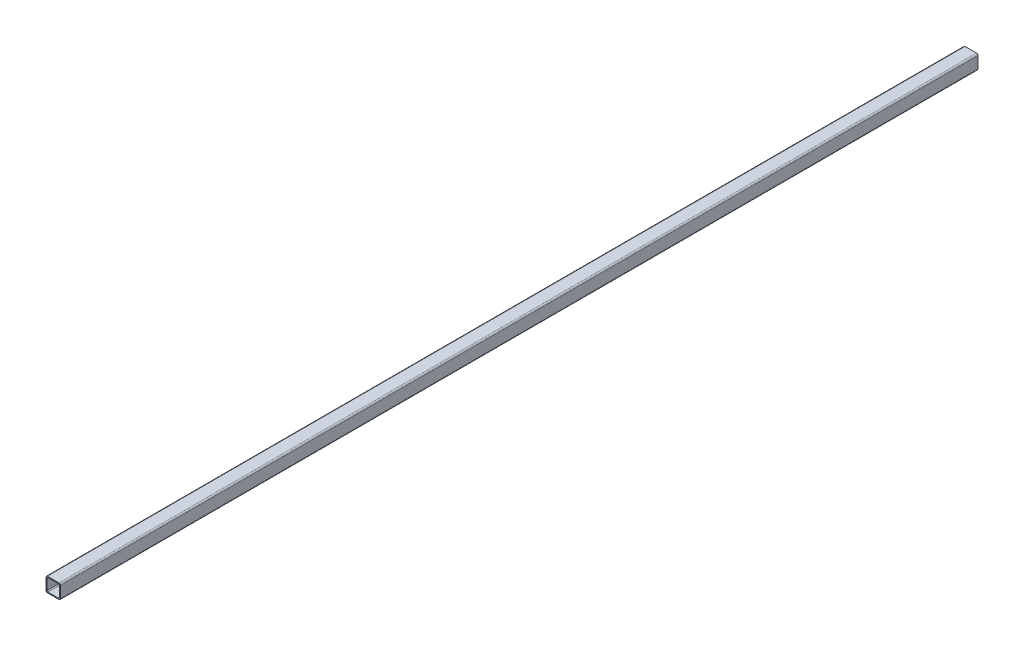
ISO-10303-21;
HEADER;
FILE_DESCRIPTION(('STEP AP214'),'2;1');
FILE_NAME('part.step','',(''),(''),'','','');
FILE_SCHEMA(('AUTOMOTIVE_DESIGN { 1 0 10303 214 1 1 1 1 }'));
ENDSEC;
DATA;
#1=APPLICATION_CONTEXT('core data for automotive mechanical design processes');
#2=APPLICATION_PROTOCOL_DEFINITION('international standard','automotive_design',2000,#1);
#3=PRODUCT_CONTEXT('',#1,'mechanical');
#4=PRODUCT('Part','Part','',(#3));
#5=PRODUCT_RELATED_PRODUCT_CATEGORY('part','',(#4));
#6=PRODUCT_DEFINITION_FORMATION('','',#4);
#7=PRODUCT_DEFINITION_CONTEXT('part definition',#1,'design');
#8=PRODUCT_DEFINITION('design','',#6,#7);
#9=PRODUCT_DEFINITION_SHAPE('','',#8);
#10=(LENGTH_UNIT() NAMED_UNIT(*) SI_UNIT(.MILLI.,.METRE.));
#11=(NAMED_UNIT(*) PLANE_ANGLE_UNIT() SI_UNIT($,.RADIAN.));
#12=(NAMED_UNIT(*) SI_UNIT($,.STERADIAN.) SOLID_ANGLE_UNIT());
#13=UNCERTAINTY_MEASURE_WITH_UNIT(LENGTH_MEASURE(1.E-05),#10,'distance_accuracy_value','');
#14=(GEOMETRIC_REPRESENTATION_CONTEXT(3) GLOBAL_UNCERTAINTY_ASSIGNED_CONTEXT((#13)) GLOBAL_UNIT_ASSIGNED_CONTEXT((#10,
#11,#12)) REPRESENTATION_CONTEXT('',''));
#15=CARTESIAN_POINT('',(0.,0.,0.));
#16=DIRECTION('',(0.,0.,1.));
#17=DIRECTION('',(1.,0.,0.));
#18=AXIS2_PLACEMENT_3D('',#15,#16,#17);
#19=CARTESIAN_POINT('',(-27.0000000000001,0.,-1952.42640687119));
#20=DIRECTION('',(0.,-1.,0.));
#21=DIRECTION('',(1.,0.,0.));
#22=AXIS2_PLACEMENT_3D('',#19,#20,#21);
#23=PLANE('',#22);
#24=DIRECTION('',(-1.,0.,0.));
#25=VECTOR('',#24,1.);
#26=CARTESIAN_POINT('',(-27.0000000000001,0.,-1910.));
#27=LINE('',#26,#25);
#28=CARTESIAN_POINT('',(-3.00000000000005,0.,-1910.));
#29=VERTEX_POINT('',#28);
#30=CARTESIAN_POINT('',(-27.0000000000001,0.,-1910.));
#31=VERTEX_POINT('',#30);
#32=EDGE_CURVE('E11',#29,#31,#27,.T.);
#33=ORIENTED_EDGE('',*,*,#32,.F.);
#34=DIRECTION('',(0.,0.,1.));
#35=VECTOR('',#34,1.);
#36=CARTESIAN_POINT('',(-3.00000000000005,0.,-1952.42640687119));
#37=LINE('',#36,#35);
#38=CARTESIAN_POINT('',(-3.00000000000005,0.,0.));
#39=VERTEX_POINT('',#38);
#40=EDGE_CURVE('E236',#29,#39,#37,.T.);
#41=ORIENTED_EDGE('',*,*,#40,.T.);
#42=DIRECTION('',(1.,0.,0.));
#43=VECTOR('',#42,1.);
#44=CARTESIAN_POINT('',(-27.0000000000001,0.,0.));
#45=LINE('',#44,#43);
#46=CARTESIAN_POINT('',(-27.0000000000001,0.,0.));
#47=VERTEX_POINT('',#46);
#48=EDGE_CURVE('E202',#47,#39,#45,.T.);
#49=ORIENTED_EDGE('',*,*,#48,.F.);
#50=DIRECTION('',(0.,0.,1.));
#51=VECTOR('',#50,1.);
#52=CARTESIAN_POINT('',(-27.0000000000001,0.,-1952.42640687119));
#53=LINE('',#52,#51);
#54=EDGE_CURVE('E223',#31,#47,#53,.T.);
#55=ORIENTED_EDGE('',*,*,#54,.F.);
#56=EDGE_LOOP('',(#33,#41,#49,#55));
#57=FACE_BOUND('',#56,.T.);
#58=ADVANCED_FACE('F37',(#57),#23,.T.);
#59=CARTESIAN_POINT('',(-3.00000000000005,3.,-1952.42640687119));
#60=DIRECTION('',(0.,0.,1.));
#61=DIRECTION('',(1.,0.,0.));
#62=AXIS2_PLACEMENT_3D('',#59,#60,#61);
#63=CYLINDRICAL_SURFACE('',#62,3.);
#64=CARTESIAN_POINT('',(-3.00000000000005,3.,-1910.));
#65=DIRECTION('',(0.,0.,1.));
#66=DIRECTION('',(0.,-1.,0.));
#67=AXIS2_PLACEMENT_3D('',#64,#65,#66);
#68=CIRCLE('',#67,3.);
#69=CARTESIAN_POINT('',(0.,3.,-1910.));
#70=VERTEX_POINT('',#69);
#71=EDGE_CURVE('E303',#70,#29,#68,.F.);
#72=ORIENTED_EDGE('',*,*,#71,.F.);
#73=DIRECTION('',(0.,0.,1.));
#74=VECTOR('',#73,1.);
#75=CARTESIAN_POINT('',(0.,3.,-1952.42640687119));
#76=LINE('',#75,#74);
#77=CARTESIAN_POINT('',(0.,3.,0.));
#78=VERTEX_POINT('',#77);
#79=EDGE_CURVE('E234',#70,#78,#76,.T.);
#80=ORIENTED_EDGE('',*,*,#79,.T.);
#81=CARTESIAN_POINT('',(-3.00000000000005,3.,0.));
#82=DIRECTION('',(0.,0.,1.));
#83=DIRECTION('',(1.,0.,0.));
#84=AXIS2_PLACEMENT_3D('',#81,#82,#83);
#85=CIRCLE('',#84,3.);
#86=EDGE_CURVE('E205',#39,#78,#85,.T.);
#87=ORIENTED_EDGE('',*,*,#86,.F.);
#88=ORIENTED_EDGE('',*,*,#40,.F.);
#89=EDGE_LOOP('',(#72,#80,#87,#88));
#90=FACE_BOUND('',#89,.T.);
#91=ADVANCED_FACE('F327',(#90),#63,.T.);
#92=CARTESIAN_POINT('',(0.,27.,-1952.42640687119));
#93=DIRECTION('',(1.,0.,0.));
#94=DIRECTION('',(0.,1.,0.));
#95=AXIS2_PLACEMENT_3D('',#92,#93,#94);
#96=PLANE('',#95);
#97=DIRECTION('',(0.,-1.,0.));
#98=VECTOR('',#97,1.);
#99=CARTESIAN_POINT('',(0.,27.,-1910.));
#100=LINE('',#99,#98);
#101=CARTESIAN_POINT('',(0.,27.,-1910.));
#102=VERTEX_POINT('',#101);
#103=EDGE_CURVE('E305',#102,#70,#100,.T.);
#104=ORIENTED_EDGE('',*,*,#103,.F.);
#105=DIRECTION('',(0.,0.,1.));
#106=VECTOR('',#105,1.);
#107=CARTESIAN_POINT('',(0.,27.,-1952.42640687119));
#108=LINE('',#107,#106);
#109=CARTESIAN_POINT('',(0.,27.,0.));
#110=VERTEX_POINT('',#109);
#111=EDGE_CURVE('E232',#102,#110,#108,.T.);
#112=ORIENTED_EDGE('',*,*,#111,.T.);
#113=DIRECTION('',(0.,1.,0.));
#114=VECTOR('',#113,1.);
#115=CARTESIAN_POINT('',(0.,27.,0.));
#116=LINE('',#115,#114);
#117=EDGE_CURVE('E208',#78,#110,#116,.T.);
#118=ORIENTED_EDGE('',*,*,#117,.F.);
#119=ORIENTED_EDGE('',*,*,#79,.F.);
#120=EDGE_LOOP('',(#104,#112,#118,#119));
#121=FACE_BOUND('',#120,.T.);
#122=ADVANCED_FACE('F324',(#121),#96,.T.);
#123=CARTESIAN_POINT('',(-3.00000000000005,27.,-1952.42640687119));
#124=DIRECTION('',(0.,0.,1.));
#125=DIRECTION('',(1.,0.,0.));
#126=AXIS2_PLACEMENT_3D('',#123,#124,#125);
#127=CYLINDRICAL_SURFACE('',#126,3.);
#128=CARTESIAN_POINT('',(-3.00000000000005,27.,-1910.));
#129=DIRECTION('',(0.,0.,1.));
#130=DIRECTION('',(0.,-1.,0.));
#131=AXIS2_PLACEMENT_3D('',#128,#129,#130);
#132=CIRCLE('',#131,3.);
#133=CARTESIAN_POINT('',(-3.00000000000005,30.,-1910.));
#134=VERTEX_POINT('',#133);
#135=EDGE_CURVE('E307',#134,#102,#132,.F.);
#136=ORIENTED_EDGE('',*,*,#135,.F.);
#137=DIRECTION('',(0.,0.,1.));
#138=VECTOR('',#137,1.);
#139=CARTESIAN_POINT('',(-3.00000000000005,30.,-1952.42640687119));
#140=LINE('',#139,#138);
#141=CARTESIAN_POINT('',(-3.00000000000005,30.,0.));
#142=VERTEX_POINT('',#141);
#143=EDGE_CURVE('E230',#134,#142,#140,.T.);
#144=ORIENTED_EDGE('',*,*,#143,.T.);
#145=CARTESIAN_POINT('',(-3.00000000000005,27.,0.));
#146=DIRECTION('',(0.,0.,1.));
#147=DIRECTION('',(-1.,0.,0.));
#148=AXIS2_PLACEMENT_3D('',#145,#146,#147);
#149=CIRCLE('',#148,3.);
#150=EDGE_CURVE('E211',#110,#142,#149,.T.);
#151=ORIENTED_EDGE('',*,*,#150,.F.);
#152=ORIENTED_EDGE('',*,*,#111,.F.);
#153=EDGE_LOOP('',(#136,#144,#151,#152));
#154=FACE_BOUND('',#153,.T.);
#155=ADVANCED_FACE('F317',(#154),#127,.T.);
#156=CARTESIAN_POINT('',(-27.,30.,-1952.42640687119));
#157=DIRECTION('',(0.,1.,0.));
#158=DIRECTION('',(0.,0.,1.));
#159=AXIS2_PLACEMENT_3D('',#156,#157,#158);
#160=PLANE('',#159);
#161=DIRECTION('',(1.,0.,0.));
#162=VECTOR('',#161,1.);
#163=CARTESIAN_POINT('',(-27.,30.,-1910.));
#164=LINE('',#163,#162);
#165=CARTESIAN_POINT('',(-27.,30.,-1910.));
#166=VERTEX_POINT('',#165);
#167=EDGE_CURVE('E261',#166,#134,#164,.T.);
#168=ORIENTED_EDGE('',*,*,#167,.F.);
#169=DIRECTION('',(0.,0.,1.));
#170=VECTOR('',#169,1.);
#171=CARTESIAN_POINT('',(-27.,30.,-1952.42640687119));
#172=LINE('',#171,#170);
#173=CARTESIAN_POINT('',(-27.,30.,0.));
#174=VERTEX_POINT('',#173);
#175=EDGE_CURVE('E228',#166,#174,#172,.T.);
#176=ORIENTED_EDGE('',*,*,#175,.T.);
#177=DIRECTION('',(-1.,0.,0.));
#178=VECTOR('',#177,1.);
#179=CARTESIAN_POINT('',(-27.,30.,0.));
#180=LINE('',#179,#178);
#181=EDGE_CURVE('E214',#142,#174,#180,.T.);
#182=ORIENTED_EDGE('',*,*,#181,.F.);
#183=ORIENTED_EDGE('',*,*,#143,.F.);
#184=EDGE_LOOP('',(#168,#176,#182,#183));
#185=FACE_BOUND('',#184,.T.);
#186=ADVANCED_FACE('F320',(#185),#160,.T.);
#187=CARTESIAN_POINT('',(-27.0000000000001,27.,-1952.42640687119));
#188=DIRECTION('',(0.,0.,1.));
#189=DIRECTION('',(1.,0.,0.));
#190=AXIS2_PLACEMENT_3D('',#187,#188,#189);
#191=CYLINDRICAL_SURFACE('',#190,3.);
#192=CARTESIAN_POINT('',(-27.0000000000001,27.,-1910.));
#193=DIRECTION('',(0.,0.,1.));
#194=DIRECTION('',(0.,-1.,0.));
#195=AXIS2_PLACEMENT_3D('',#192,#193,#194);
#196=CIRCLE('',#195,3.);
#197=CARTESIAN_POINT('',(-30.0000000000001,27.,-1910.));
#198=VERTEX_POINT('',#197);
#199=EDGE_CURVE('E257',#198,#166,#196,.F.);
#200=ORIENTED_EDGE('',*,*,#199,.F.);
#201=DIRECTION('',(0.,0.,1.));
#202=VECTOR('',#201,1.);
#203=CARTESIAN_POINT('',(-30.0000000000001,27.,-1952.42640687119));
#204=LINE('',#203,#202);
#205=CARTESIAN_POINT('',(-30.0000000000001,27.,0.));
#206=VERTEX_POINT('',#205);
#207=EDGE_CURVE('E226',#198,#206,#204,.T.);
#208=ORIENTED_EDGE('',*,*,#207,.T.);
#209=CARTESIAN_POINT('',(-27.0000000000001,27.,0.));
#210=DIRECTION('',(0.,0.,1.));
#211=DIRECTION('',(1.,0.,0.));
#212=AXIS2_PLACEMENT_3D('',#209,#210,#211);
#213=CIRCLE('',#212,3.);
#214=EDGE_CURVE('E217',#174,#206,#213,.T.);
#215=ORIENTED_EDGE('',*,*,#214,.F.);
#216=ORIENTED_EDGE('',*,*,#175,.F.);
#217=EDGE_LOOP('',(#200,#208,#215,#216));
#218=FACE_BOUND('',#217,.T.);
#219=ADVANCED_FACE('F340',(#218),#191,.T.);
#220=CARTESIAN_POINT('',(-30.0000000000001,27.,-1952.42640687119));
#221=DIRECTION('',(-1.,0.,0.));
#222=DIRECTION('',(0.,0.,1.));
#223=AXIS2_PLACEMENT_3D('',#220,#221,#222);
#224=PLANE('',#223);
#225=DIRECTION('',(0.,1.,0.));
#226=VECTOR('',#225,1.);
#227=CARTESIAN_POINT('',(-30.0000000000001,27.,-1910.));
#228=LINE('',#227,#226);
#229=CARTESIAN_POINT('',(-30.0000000000001,3.00000000000001,-1910.));
#230=VERTEX_POINT('',#229);
#231=EDGE_CURVE('E254',#230,#198,#228,.T.);
#232=ORIENTED_EDGE('',*,*,#231,.F.);
#233=DIRECTION('',(0.,0.,1.));
#234=VECTOR('',#233,1.);
#235=CARTESIAN_POINT('',(-30.0000000000001,3.,-1952.42640687119));
#236=LINE('',#235,#234);
#237=CARTESIAN_POINT('',(-30.0000000000001,3.,0.));
#238=VERTEX_POINT('',#237);
#239=EDGE_CURVE('E224',#230,#238,#236,.T.);
#240=ORIENTED_EDGE('',*,*,#239,.T.);
#241=DIRECTION('',(0.,-1.,0.));
#242=VECTOR('',#241,1.);
#243=CARTESIAN_POINT('',(-30.0000000000001,27.,0.));
#244=LINE('',#243,#242);
#245=EDGE_CURVE('E220',#206,#238,#244,.T.);
#246=ORIENTED_EDGE('',*,*,#245,.F.);
#247=ORIENTED_EDGE('',*,*,#207,.F.);
#248=EDGE_LOOP('',(#232,#240,#246,#247));
#249=FACE_BOUND('',#248,.T.);
#250=ADVANCED_FACE('F253',(#249),#224,.T.);
#251=CARTESIAN_POINT('',(-27.0000000000001,3.,-1952.42640687119));
#252=DIRECTION('',(0.,0.,1.));
#253=DIRECTION('',(1.,0.,0.));
#254=AXIS2_PLACEMENT_3D('',#251,#252,#253);
#255=CYLINDRICAL_SURFACE('',#254,3.);
#256=CARTESIAN_POINT('',(-27.0000000000001,3.,-1910.));
#257=DIRECTION('',(0.,0.,1.));
#258=DIRECTION('',(0.,-1.,0.));
#259=AXIS2_PLACEMENT_3D('',#256,#257,#258);
#260=CIRCLE('',#259,3.);
#261=EDGE_CURVE('E243',#31,#230,#260,.F.);
#262=ORIENTED_EDGE('',*,*,#261,.F.);
#263=ORIENTED_EDGE('',*,*,#54,.T.);
#264=CARTESIAN_POINT('',(-27.0000000000001,3.,0.));
#265=DIRECTION('',(0.,0.,1.));
#266=DIRECTION('',(1.,0.,0.));
#267=AXIS2_PLACEMENT_3D('',#264,#265,#266);
#268=CIRCLE('',#267,3.);
#269=EDGE_CURVE('E189',#238,#47,#268,.T.);
#270=ORIENTED_EDGE('',*,*,#269,.F.);
#271=ORIENTED_EDGE('',*,*,#239,.F.);
#272=EDGE_LOOP('',(#262,#263,#270,#271));
#273=FACE_BOUND('',#272,.T.);
#274=ADVANCED_FACE('F39',(#273),#255,.T.);
#275=CARTESIAN_POINT('',(-27.0000000000001,3.,0.));
#276=DIRECTION('',(0.,0.,1.));
#277=DIRECTION('',(1.,0.,0.));
#278=AXIS2_PLACEMENT_3D('',#275,#276,#277);
#279=PLANE('',#278);
#280=CARTESIAN_POINT('',(-26.0000000000001,4.00000000000001,0.));
#281=DIRECTION('',(0.,0.,1.));
#282=DIRECTION('',(1.,0.,0.));
#283=AXIS2_PLACEMENT_3D('',#280,#281,#282);
#284=CIRCLE('',#283,2.);
#285=CARTESIAN_POINT('',(-28.0000000000001,4.00000000000002,0.));
#286=VERTEX_POINT('',#285);
#287=CARTESIAN_POINT('',(-26.,2.00000000000001,0.));
#288=VERTEX_POINT('',#287);
#289=EDGE_CURVE('E164',#286,#288,#284,.T.);
#290=ORIENTED_EDGE('',*,*,#289,.F.);
#291=DIRECTION('',(0.,-1.,0.));
#292=VECTOR('',#291,1.);
#293=CARTESIAN_POINT('',(-28.0000000000001,26.,0.));
#294=LINE('',#293,#292);
#295=CARTESIAN_POINT('',(-28.0000000000001,26.,0.));
#296=VERTEX_POINT('',#295);
#297=EDGE_CURVE('E184',#296,#286,#294,.T.);
#298=ORIENTED_EDGE('',*,*,#297,.F.);
#299=CARTESIAN_POINT('',(-26.0000000000001,26.,0.));
#300=DIRECTION('',(0.,0.,1.));
#301=DIRECTION('',(1.,0.,0.));
#302=AXIS2_PLACEMENT_3D('',#299,#300,#301);
#303=CIRCLE('',#302,2.);
#304=CARTESIAN_POINT('',(-26.,28.,0.));
#305=VERTEX_POINT('',#304);
#306=EDGE_CURVE('E181',#305,#296,#303,.T.);
#307=ORIENTED_EDGE('',*,*,#306,.F.);
#308=DIRECTION('',(-1.,0.,0.));
#309=VECTOR('',#308,1.);
#310=CARTESIAN_POINT('',(-26.,28.,0.));
#311=LINE('',#310,#309);
#312=CARTESIAN_POINT('',(-4.00000000000007,28.,0.));
#313=VERTEX_POINT('',#312);
#314=EDGE_CURVE('E178',#313,#305,#311,.T.);
#315=ORIENTED_EDGE('',*,*,#314,.F.);
#316=CARTESIAN_POINT('',(-4.00000000000005,26.,0.));
#317=DIRECTION('',(0.,0.,1.));
#318=DIRECTION('',(-1.,0.,0.));
#319=AXIS2_PLACEMENT_3D('',#316,#317,#318);
#320=CIRCLE('',#319,2.);
#321=CARTESIAN_POINT('',(-2.00000000000005,26.,0.));
#322=VERTEX_POINT('',#321);
#323=EDGE_CURVE('E172',#322,#313,#320,.T.);
#324=ORIENTED_EDGE('',*,*,#323,.F.);
#325=DIRECTION('',(0.,1.,0.));
#326=VECTOR('',#325,1.);
#327=CARTESIAN_POINT('',(-2.00000000000005,26.,0.));
#328=LINE('',#327,#326);
#329=CARTESIAN_POINT('',(-2.00000000000005,4.00000000000002,0.));
#330=VERTEX_POINT('',#329);
#331=EDGE_CURVE('E170',#330,#322,#328,.T.);
#332=ORIENTED_EDGE('',*,*,#331,.F.);
#333=CARTESIAN_POINT('',(-4.00000000000005,4.00000000000001,0.));
#334=DIRECTION('',(0.,0.,1.));
#335=DIRECTION('',(1.,0.,0.));
#336=AXIS2_PLACEMENT_3D('',#333,#334,#335);
#337=CIRCLE('',#336,2.);
#338=CARTESIAN_POINT('',(-4.00000000000007,2.00000000000001,0.));
#339=VERTEX_POINT('',#338);
#340=EDGE_CURVE('E151',#339,#330,#337,.T.);
#341=ORIENTED_EDGE('',*,*,#340,.F.);
#342=DIRECTION('',(1.,0.,0.));
#343=VECTOR('',#342,1.);
#344=CARTESIAN_POINT('',(-26.,2.00000000000001,0.));
#345=LINE('',#344,#343);
#346=EDGE_CURVE('E158',#288,#339,#345,.T.);
#347=ORIENTED_EDGE('',*,*,#346,.F.);
#348=EDGE_LOOP('',(#290,#298,#307,#315,#324,#332,#341,#347));
#349=FACE_BOUND('',#348,.T.);
#350=ORIENTED_EDGE('',*,*,#269,.T.);
#351=ORIENTED_EDGE('',*,*,#48,.T.);
#352=ORIENTED_EDGE('',*,*,#86,.T.);
#353=ORIENTED_EDGE('',*,*,#117,.T.);
#354=ORIENTED_EDGE('',*,*,#150,.T.);
#355=ORIENTED_EDGE('',*,*,#181,.T.);
#356=ORIENTED_EDGE('',*,*,#214,.T.);
#357=ORIENTED_EDGE('',*,*,#245,.T.);
#358=EDGE_LOOP('',(#350,#351,#352,#353,#354,#355,#356,#357));
#359=FACE_BOUND('',#358,.T.);
#360=ADVANCED_FACE('F166',(#349,#359),#279,.T.);
#361=CARTESIAN_POINT('',(-26.,2.00000000000001,-1952.42640687119));
#362=DIRECTION('',(0.,-1.,0.));
#363=DIRECTION('',(0.,0.,-1.));
#364=AXIS2_PLACEMENT_3D('',#361,#362,#363);
#365=PLANE('',#364);
#366=DIRECTION('',(0.,0.,1.));
#367=VECTOR('',#366,1.);
#368=CARTESIAN_POINT('',(-4.00000000000007,2.00000000000001,-1952.42640687119));
#369=LINE('',#368,#367);
#370=CARTESIAN_POINT('',(-4.00000000000007,2.00000000000001,-1910.));
#371=VERTEX_POINT('',#370);
#372=EDGE_CURVE('E147',#371,#339,#369,.T.);
#373=ORIENTED_EDGE('',*,*,#372,.F.);
#374=DIRECTION('',(-1.,0.,0.));
#375=VECTOR('',#374,1.);
#376=CARTESIAN_POINT('',(-26.,2.00000000000001,-1910.));
#377=LINE('',#376,#375);
#378=CARTESIAN_POINT('',(-26.,2.00000000000001,-1910.));
#379=VERTEX_POINT('',#378);
#380=EDGE_CURVE('E41',#371,#379,#377,.T.);
#381=ORIENTED_EDGE('',*,*,#380,.T.);
#382=DIRECTION('',(0.,0.,1.));
#383=VECTOR('',#382,1.);
#384=CARTESIAN_POINT('',(-26.,2.00000000000001,-1952.42640687119));
#385=LINE('',#384,#383);
#386=EDGE_CURVE('E155',#379,#288,#385,.T.);
#387=ORIENTED_EDGE('',*,*,#386,.T.);
#388=ORIENTED_EDGE('',*,*,#346,.T.);
#389=EDGE_LOOP('',(#373,#381,#387,#388));
#390=FACE_BOUND('',#389,.T.);
#391=ADVANCED_FACE('F159',(#390),#365,.F.);
#392=CARTESIAN_POINT('',(-4.00000000000005,4.00000000000001,-1952.42640687119));
#393=DIRECTION('',(0.,0.,1.));
#394=DIRECTION('',(1.,0.,0.));
#395=AXIS2_PLACEMENT_3D('',#392,#393,#394);
#396=CYLINDRICAL_SURFACE('',#395,2.);
#397=DIRECTION('',(0.,0.,1.));
#398=VECTOR('',#397,1.);
#399=CARTESIAN_POINT('',(-2.00000000000005,4.00000000000002,-1952.42640687119));
#400=LINE('',#399,#398);
#401=CARTESIAN_POINT('',(-2.00000000000005,4.00000000000002,-1910.));
#402=VERTEX_POINT('',#401);
#403=EDGE_CURVE('E154',#402,#330,#400,.T.);
#404=ORIENTED_EDGE('',*,*,#403,.F.);
#405=CARTESIAN_POINT('',(-4.00000000000005,4.00000000000001,-1910.));
#406=DIRECTION('',(0.,0.,1.));
#407=DIRECTION('',(0.,-1.,0.));
#408=AXIS2_PLACEMENT_3D('',#405,#406,#407);
#409=CIRCLE('',#408,2.);
#410=EDGE_CURVE('E46',#402,#371,#409,.F.);
#411=ORIENTED_EDGE('',*,*,#410,.T.);
#412=ORIENTED_EDGE('',*,*,#372,.T.);
#413=ORIENTED_EDGE('',*,*,#340,.T.);
#414=EDGE_LOOP('',(#404,#411,#412,#413));
#415=FACE_BOUND('',#414,.T.);
#416=ADVANCED_FACE('F149',(#415),#396,.F.);
#417=CARTESIAN_POINT('',(-2.00000000000005,26.,-1952.42640687119));
#418=DIRECTION('',(1.,0.,0.));
#419=DIRECTION('',(0.,0.,-1.));
#420=AXIS2_PLACEMENT_3D('',#417,#418,#419);
#421=PLANE('',#420);
#422=DIRECTION('',(0.,0.,1.));
#423=VECTOR('',#422,1.);
#424=CARTESIAN_POINT('',(-2.00000000000005,26.,-1952.42640687119));
#425=LINE('',#424,#423);
#426=CARTESIAN_POINT('',(-2.00000000000005,26.,-1910.));
#427=VERTEX_POINT('',#426);
#428=EDGE_CURVE('E196',#427,#322,#425,.T.);
#429=ORIENTED_EDGE('',*,*,#428,.F.);
#430=DIRECTION('',(0.,-1.,0.));
#431=VECTOR('',#430,1.);
#432=CARTESIAN_POINT('',(-2.00000000000005,26.,-1910.));
#433=LINE('',#432,#431);
#434=EDGE_CURVE('E293',#427,#402,#433,.T.);
#435=ORIENTED_EDGE('',*,*,#434,.T.);
#436=ORIENTED_EDGE('',*,*,#403,.T.);
#437=ORIENTED_EDGE('',*,*,#331,.T.);
#438=EDGE_LOOP('',(#429,#435,#436,#437));
#439=FACE_BOUND('',#438,.T.);
#440=ADVANCED_FACE('F292',(#439),#421,.F.);
#441=CARTESIAN_POINT('',(-4.00000000000005,26.,-1952.42640687119));
#442=DIRECTION('',(0.,0.,1.));
#443=DIRECTION('',(1.,0.,0.));
#444=AXIS2_PLACEMENT_3D('',#441,#442,#443);
#445=CYLINDRICAL_SURFACE('',#444,2.);
#446=DIRECTION('',(0.,0.,1.));
#447=VECTOR('',#446,1.);
#448=CARTESIAN_POINT('',(-4.00000000000007,28.,-1952.42640687119));
#449=LINE('',#448,#447);
#450=CARTESIAN_POINT('',(-4.00000000000007,28.,-1910.));
#451=VERTEX_POINT('',#450);
#452=EDGE_CURVE('E194',#451,#313,#449,.T.);
#453=ORIENTED_EDGE('',*,*,#452,.F.);
#454=CARTESIAN_POINT('',(-4.00000000000005,26.,-1910.));
#455=DIRECTION('',(0.,0.,1.));
#456=DIRECTION('',(0.,-1.,0.));
#457=AXIS2_PLACEMENT_3D('',#454,#455,#456);
#458=CIRCLE('',#457,2.);
#459=EDGE_CURVE('E289',#451,#427,#458,.F.);
#460=ORIENTED_EDGE('',*,*,#459,.T.);
#461=ORIENTED_EDGE('',*,*,#428,.T.);
#462=ORIENTED_EDGE('',*,*,#323,.T.);
#463=EDGE_LOOP('',(#453,#460,#461,#462));
#464=FACE_BOUND('',#463,.T.);
#465=ADVANCED_FACE('F286',(#464),#445,.F.);
#466=CARTESIAN_POINT('',(-26.,28.,-1952.42640687119));
#467=DIRECTION('',(0.,1.,0.));
#468=DIRECTION('',(0.,0.,1.));
#469=AXIS2_PLACEMENT_3D('',#466,#467,#468);
#470=PLANE('',#469);
#471=DIRECTION('',(0.,0.,1.));
#472=VECTOR('',#471,1.);
#473=CARTESIAN_POINT('',(-26.,28.,-1952.42640687119));
#474=LINE('',#473,#472);
#475=CARTESIAN_POINT('',(-26.,28.,-1910.));
#476=VERTEX_POINT('',#475);
#477=EDGE_CURVE('E192',#476,#305,#474,.T.);
#478=ORIENTED_EDGE('',*,*,#477,.F.);
#479=DIRECTION('',(1.,0.,0.));
#480=VECTOR('',#479,1.);
#481=CARTESIAN_POINT('',(-26.,28.,-1910.));
#482=LINE('',#481,#480);
#483=EDGE_CURVE('E296',#476,#451,#482,.T.);
#484=ORIENTED_EDGE('',*,*,#483,.T.);
#485=ORIENTED_EDGE('',*,*,#452,.T.);
#486=ORIENTED_EDGE('',*,*,#314,.T.);
#487=EDGE_LOOP('',(#478,#484,#485,#486));
#488=FACE_BOUND('',#487,.T.);
#489=ADVANCED_FACE('F283',(#488),#470,.F.);
#490=CARTESIAN_POINT('',(-26.0000000000001,26.,-1952.42640687119));
#491=DIRECTION('',(0.,0.,1.));
#492=DIRECTION('',(1.,0.,0.));
#493=AXIS2_PLACEMENT_3D('',#490,#491,#492);
#494=CYLINDRICAL_SURFACE('',#493,2.);
#495=DIRECTION('',(0.,0.,1.));
#496=VECTOR('',#495,1.);
#497=CARTESIAN_POINT('',(-28.0000000000001,26.,-1952.42640687119));
#498=LINE('',#497,#496);
#499=CARTESIAN_POINT('',(-28.0000000000001,26.,-1910.));
#500=VERTEX_POINT('',#499);
#501=EDGE_CURVE('E190',#500,#296,#498,.T.);
#502=ORIENTED_EDGE('',*,*,#501,.F.);
#503=CARTESIAN_POINT('',(-26.0000000000001,26.,-1910.));
#504=DIRECTION('',(0.,0.,1.));
#505=DIRECTION('',(0.,-1.,0.));
#506=AXIS2_PLACEMENT_3D('',#503,#504,#505);
#507=CIRCLE('',#506,2.);
#508=EDGE_CURVE('E280',#500,#476,#507,.F.);
#509=ORIENTED_EDGE('',*,*,#508,.T.);
#510=ORIENTED_EDGE('',*,*,#477,.T.);
#511=ORIENTED_EDGE('',*,*,#306,.T.);
#512=EDGE_LOOP('',(#502,#509,#510,#511));
#513=FACE_BOUND('',#512,.T.);
#514=ADVANCED_FACE('F278',(#513),#494,.F.);
#515=CARTESIAN_POINT('',(-28.0000000000001,26.,-1952.42640687119));
#516=DIRECTION('',(-1.,0.,0.));
#517=DIRECTION('',(0.,0.,1.));
#518=AXIS2_PLACEMENT_3D('',#515,#516,#517);
#519=PLANE('',#518);
#520=DIRECTION('',(0.,0.,1.));
#521=VECTOR('',#520,1.);
#522=CARTESIAN_POINT('',(-28.0000000000001,4.00000000000002,-1952.42640687119));
#523=LINE('',#522,#521);
#524=CARTESIAN_POINT('',(-28.0000000000001,4.00000000000002,-1910.));
#525=VERTEX_POINT('',#524);
#526=EDGE_CURVE('E187',#525,#286,#523,.T.);
#527=ORIENTED_EDGE('',*,*,#526,.F.);
#528=DIRECTION('',(0.,1.,0.));
#529=VECTOR('',#528,1.);
#530=CARTESIAN_POINT('',(-28.0000000000001,26.,-1910.));
#531=LINE('',#530,#529);
#532=EDGE_CURVE('E275',#525,#500,#531,.T.);
#533=ORIENTED_EDGE('',*,*,#532,.T.);
#534=ORIENTED_EDGE('',*,*,#501,.T.);
#535=ORIENTED_EDGE('',*,*,#297,.T.);
#536=EDGE_LOOP('',(#527,#533,#534,#535));
#537=FACE_BOUND('',#536,.T.);
#538=ADVANCED_FACE('F272',(#537),#519,.F.);
#539=CARTESIAN_POINT('',(-26.0000000000001,4.00000000000001,-1952.42640687119));
#540=DIRECTION('',(0.,0.,1.));
#541=DIRECTION('',(1.,0.,0.));
#542=AXIS2_PLACEMENT_3D('',#539,#540,#541);
#543=CYLINDRICAL_SURFACE('',#542,2.);
#544=ORIENTED_EDGE('',*,*,#386,.F.);
#545=CARTESIAN_POINT('',(-26.0000000000001,4.00000000000001,-1910.));
#546=DIRECTION('',(0.,0.,1.));
#547=DIRECTION('',(0.,-1.,0.));
#548=AXIS2_PLACEMENT_3D('',#545,#546,#547);
#549=CIRCLE('',#548,2.);
#550=EDGE_CURVE('E259',#379,#525,#549,.F.);
#551=ORIENTED_EDGE('',*,*,#550,.T.);
#552=ORIENTED_EDGE('',*,*,#526,.T.);
#553=ORIENTED_EDGE('',*,*,#289,.T.);
#554=EDGE_LOOP('',(#544,#551,#552,#553));
#555=FACE_BOUND('',#554,.T.);
#556=ADVANCED_FACE('F265',(#555),#543,.F.);
#557=CARTESIAN_POINT('',(-482.500000000008,2.99999999999975,-1910.));
#558=DIRECTION('',(0.,0.,1.));
#559=DIRECTION('',(1.,0.,0.));
#560=AXIS2_PLACEMENT_3D('',#557,#558,#559);
#561=PLANE('',#560);
#562=ORIENTED_EDGE('',*,*,#261,.T.);
#563=ORIENTED_EDGE('',*,*,#231,.T.);
#564=ORIENTED_EDGE('',*,*,#199,.T.);
#565=ORIENTED_EDGE('',*,*,#167,.T.);
#566=ORIENTED_EDGE('',*,*,#135,.T.);
#567=ORIENTED_EDGE('',*,*,#103,.T.);
#568=ORIENTED_EDGE('',*,*,#71,.T.);
#569=ORIENTED_EDGE('',*,*,#32,.T.);
#570=EDGE_LOOP('',(#562,#563,#564,#565,#566,#567,#568,#569));
#571=FACE_BOUND('',#570,.T.);
#572=ORIENTED_EDGE('',*,*,#380,.F.);
#573=ORIENTED_EDGE('',*,*,#410,.F.);
#574=ORIENTED_EDGE('',*,*,#434,.F.);
#575=ORIENTED_EDGE('',*,*,#459,.F.);
#576=ORIENTED_EDGE('',*,*,#483,.F.);
#577=ORIENTED_EDGE('',*,*,#508,.F.);
#578=ORIENTED_EDGE('',*,*,#532,.F.);
#579=ORIENTED_EDGE('',*,*,#550,.F.);
#580=EDGE_LOOP('',(#572,#573,#574,#575,#576,#577,#578,#579));
#581=FACE_BOUND('',#580,.T.);
#582=ADVANCED_FACE('F310',(#571,#581),#561,.F.);
#583=CLOSED_SHELL('',(#58,#91,#122,#155,#186,#219,#250,#274,#360,#391,#416,#440,#465,#489,#514,
#538,#556,#582));
#584=MANIFOLD_SOLID_BREP('B2',#583);
#585=ADVANCED_BREP_SHAPE_REPRESENTATION('',(#18,#584),#14);
#586=SHAPE_DEFINITION_REPRESENTATION(#9,#585);
ENDSEC;
END-ISO-10303-21;
